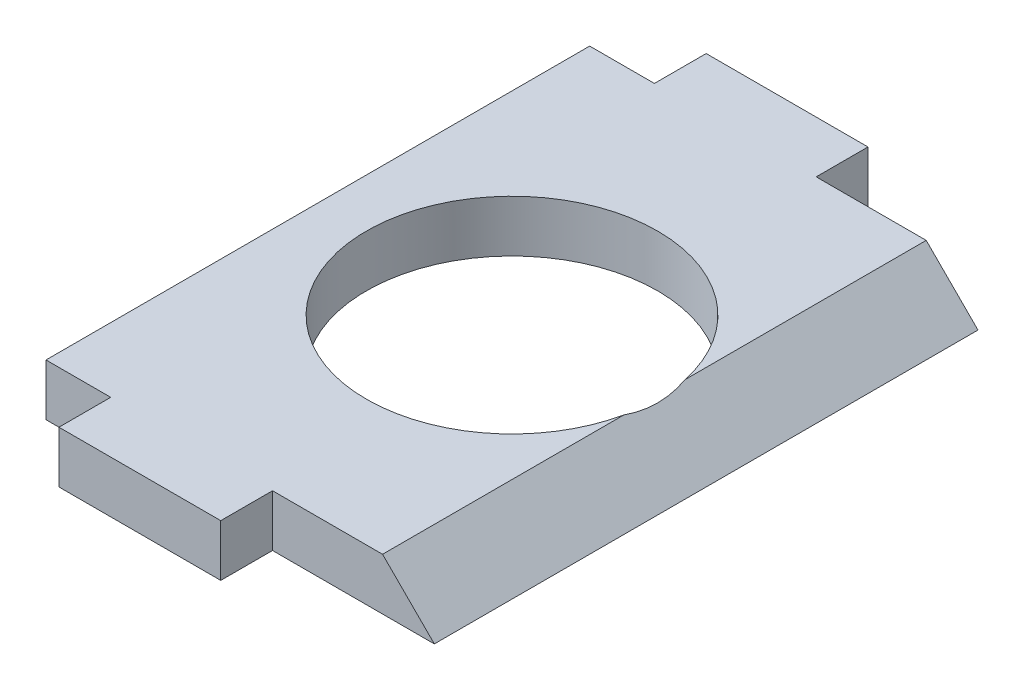
ISO-10303-21;
HEADER;
FILE_DESCRIPTION(('STEP AP214'),'2;1');
FILE_NAME('part.step','',(''),(''),'','','');
FILE_SCHEMA(('AUTOMOTIVE_DESIGN { 1 0 10303 214 1 1 1 1 }'));
ENDSEC;
DATA;
#1=APPLICATION_CONTEXT('core data for automotive mechanical design processes');
#2=APPLICATION_PROTOCOL_DEFINITION('international standard','automotive_design',2000,#1);
#3=PRODUCT_CONTEXT('',#1,'mechanical');
#4=PRODUCT('Part','Part','',(#3));
#5=PRODUCT_RELATED_PRODUCT_CATEGORY('part','',(#4));
#6=PRODUCT_DEFINITION_FORMATION('','',#4);
#7=PRODUCT_DEFINITION_CONTEXT('part definition',#1,'design');
#8=PRODUCT_DEFINITION('design','',#6,#7);
#9=PRODUCT_DEFINITION_SHAPE('','',#8);
#10=(LENGTH_UNIT() NAMED_UNIT(*) SI_UNIT(.MILLI.,.METRE.));
#11=(NAMED_UNIT(*) PLANE_ANGLE_UNIT() SI_UNIT($,.RADIAN.));
#12=(NAMED_UNIT(*) SI_UNIT($,.STERADIAN.) SOLID_ANGLE_UNIT());
#13=UNCERTAINTY_MEASURE_WITH_UNIT(LENGTH_MEASURE(1.E-05),#10,'distance_accuracy_value','');
#14=(GEOMETRIC_REPRESENTATION_CONTEXT(3) GLOBAL_UNCERTAINTY_ASSIGNED_CONTEXT((#13)) GLOBAL_UNIT_ASSIGNED_CONTEXT((#10,
#11,#12)) REPRESENTATION_CONTEXT('',''));
#15=CARTESIAN_POINT('',(0.,0.,0.));
#16=DIRECTION('',(0.,0.,1.));
#17=DIRECTION('',(1.,0.,0.));
#18=AXIS2_PLACEMENT_3D('',#15,#16,#17);
#19=CARTESIAN_POINT('',(0.,8.,-92.));
#20=DIRECTION('',(0.,0.,-1.));
#21=DIRECTION('',(-1.,0.,0.));
#22=AXIS2_PLACEMENT_3D('',#19,#20,#21);
#23=PLANE('',#22);
#24=DIRECTION('',(-0.707106781186552,0.707106781186544,0.));
#25=VECTOR('',#24,1.);
#26=CARTESIAN_POINT('',(25.9999999999997,34.,-92.));
#27=LINE('',#26,#25);
#28=CARTESIAN_POINT('',(60.,0.,-92.));
#29=VERTEX_POINT('',#28);
#30=CARTESIAN_POINT('',(51.9999999999999,8.,-92.));
#31=VERTEX_POINT('',#30);
#32=EDGE_CURVE('E169',#29,#31,#27,.T.);
#33=ORIENTED_EDGE('',*,*,#32,.F.);
#34=DIRECTION('',(1.,0.,0.));
#35=VECTOR('',#34,1.);
#36=CARTESIAN_POINT('',(0.,0.,-92.));
#37=LINE('',#36,#35);
#38=CARTESIAN_POINT('',(35.,0.,-92.));
#39=VERTEX_POINT('',#38);
#40=EDGE_CURVE('E171',#39,#29,#37,.T.);
#41=ORIENTED_EDGE('',*,*,#40,.F.);
#42=DIRECTION('',(0.,-1.,0.));
#43=VECTOR('',#42,1.);
#44=CARTESIAN_POINT('',(35.,8.,-92.));
#45=LINE('',#44,#43);
#46=CARTESIAN_POINT('',(35.,8.,-92.));
#47=VERTEX_POINT('',#46);
#48=EDGE_CURVE('E11',#47,#39,#45,.T.);
#49=ORIENTED_EDGE('',*,*,#48,.F.);
#50=DIRECTION('',(1.,0.,0.));
#51=VECTOR('',#50,1.);
#52=CARTESIAN_POINT('',(0.,8.,-92.));
#53=LINE('',#52,#51);
#54=EDGE_CURVE('E235',#47,#31,#53,.T.);
#55=ORIENTED_EDGE('',*,*,#54,.T.);
#56=EDGE_LOOP('',(#33,#41,#49,#55));
#57=FACE_BOUND('',#56,.T.);
#58=ADVANCED_FACE('F41',(#57),#23,.T.);
#59=CARTESIAN_POINT('',(35.,8.,0.));
#60=DIRECTION('',(1.,0.,0.));
#61=DIRECTION('',(0.,0.,-1.));
#62=AXIS2_PLACEMENT_3D('',#59,#60,#61);
#63=PLANE('',#62);
#64=DIRECTION('',(0.,0.,1.));
#65=VECTOR('',#64,1.);
#66=CARTESIAN_POINT('',(35.,0.,0.));
#67=LINE('',#66,#65);
#68=CARTESIAN_POINT('',(35.,0.,-100.));
#69=VERTEX_POINT('',#68);
#70=EDGE_CURVE('E174',#69,#39,#67,.T.);
#71=ORIENTED_EDGE('',*,*,#70,.F.);
#72=DIRECTION('',(0.,-1.,0.));
#73=VECTOR('',#72,1.);
#74=CARTESIAN_POINT('',(35.,8.,-100.));
#75=LINE('',#74,#73);
#76=CARTESIAN_POINT('',(35.,8.,-100.));
#77=VERTEX_POINT('',#76);
#78=EDGE_CURVE('E50',#77,#69,#75,.T.);
#79=ORIENTED_EDGE('',*,*,#78,.F.);
#80=DIRECTION('',(0.,0.,1.));
#81=VECTOR('',#80,1.);
#82=CARTESIAN_POINT('',(35.,8.,0.));
#83=LINE('',#82,#81);
#84=EDGE_CURVE('E231',#77,#47,#83,.T.);
#85=ORIENTED_EDGE('',*,*,#84,.T.);
#86=ORIENTED_EDGE('',*,*,#48,.T.);
#87=EDGE_LOOP('',(#71,#79,#85,#86));
#88=FACE_BOUND('',#87,.T.);
#89=ADVANCED_FACE('F218',(#88),#63,.T.);
#90=CARTESIAN_POINT('',(0.,8.,-100.));
#91=DIRECTION('',(0.,0.,-1.));
#92=DIRECTION('',(-1.,0.,0.));
#93=AXIS2_PLACEMENT_3D('',#90,#91,#92);
#94=PLANE('',#93);
#95=DIRECTION('',(1.,0.,0.));
#96=VECTOR('',#95,1.);
#97=CARTESIAN_POINT('',(0.,0.,-100.));
#98=LINE('',#97,#96);
#99=CARTESIAN_POINT('',(10.,0.,-100.));
#100=VERTEX_POINT('',#99);
#101=EDGE_CURVE('E177',#100,#69,#98,.T.);
#102=ORIENTED_EDGE('',*,*,#101,.F.);
#103=DIRECTION('',(0.,-1.,0.));
#104=VECTOR('',#103,1.);
#105=CARTESIAN_POINT('',(10.,8.,-100.));
#106=LINE('',#105,#104);
#107=CARTESIAN_POINT('',(10.,8.,-100.));
#108=VERTEX_POINT('',#107);
#109=EDGE_CURVE('E207',#108,#100,#106,.T.);
#110=ORIENTED_EDGE('',*,*,#109,.F.);
#111=DIRECTION('',(1.,0.,0.));
#112=VECTOR('',#111,1.);
#113=CARTESIAN_POINT('',(0.,8.,-100.));
#114=LINE('',#113,#112);
#115=EDGE_CURVE('E214',#108,#77,#114,.T.);
#116=ORIENTED_EDGE('',*,*,#115,.T.);
#117=ORIENTED_EDGE('',*,*,#78,.T.);
#118=EDGE_LOOP('',(#102,#110,#116,#117));
#119=FACE_BOUND('',#118,.T.);
#120=ADVANCED_FACE('F212',(#119),#94,.T.);
#121=CARTESIAN_POINT('',(10.,8.,0.));
#122=DIRECTION('',(-1.,0.,0.));
#123=DIRECTION('',(0.,0.,1.));
#124=AXIS2_PLACEMENT_3D('',#121,#122,#123);
#125=PLANE('',#124);
#126=DIRECTION('',(0.,0.,-1.));
#127=VECTOR('',#126,1.);
#128=CARTESIAN_POINT('',(10.,0.,0.));
#129=LINE('',#128,#127);
#130=CARTESIAN_POINT('',(10.,0.,-92.));
#131=VERTEX_POINT('',#130);
#132=EDGE_CURVE('E180',#131,#100,#129,.T.);
#133=ORIENTED_EDGE('',*,*,#132,.F.);
#134=DIRECTION('',(0.,-1.,0.));
#135=VECTOR('',#134,1.);
#136=CARTESIAN_POINT('',(10.,8.,-92.));
#137=LINE('',#136,#135);
#138=CARTESIAN_POINT('',(10.,8.,-92.));
#139=VERTEX_POINT('',#138);
#140=EDGE_CURVE('E205',#139,#131,#137,.T.);
#141=ORIENTED_EDGE('',*,*,#140,.F.);
#142=DIRECTION('',(0.,0.,-1.));
#143=VECTOR('',#142,1.);
#144=CARTESIAN_POINT('',(10.,8.,0.));
#145=LINE('',#144,#143);
#146=EDGE_CURVE('E228',#139,#108,#145,.T.);
#147=ORIENTED_EDGE('',*,*,#146,.T.);
#148=ORIENTED_EDGE('',*,*,#109,.T.);
#149=EDGE_LOOP('',(#133,#141,#147,#148));
#150=FACE_BOUND('',#149,.T.);
#151=ADVANCED_FACE('F225',(#150),#125,.T.);
#152=CARTESIAN_POINT('',(0.,8.,-92.));
#153=DIRECTION('',(0.,0.,-1.));
#154=DIRECTION('',(-1.,0.,0.));
#155=AXIS2_PLACEMENT_3D('',#152,#153,#154);
#156=PLANE('',#155);
#157=DIRECTION('',(1.,0.,0.));
#158=VECTOR('',#157,1.);
#159=CARTESIAN_POINT('',(0.,0.,-92.));
#160=LINE('',#159,#158);
#161=CARTESIAN_POINT('',(0.,0.,-92.));
#162=VERTEX_POINT('',#161);
#163=EDGE_CURVE('E183',#162,#131,#160,.T.);
#164=ORIENTED_EDGE('',*,*,#163,.F.);
#165=DIRECTION('',(0.,-1.,0.));
#166=VECTOR('',#165,1.);
#167=CARTESIAN_POINT('',(0.,8.,-92.));
#168=LINE('',#167,#166);
#169=CARTESIAN_POINT('',(0.,8.,-92.));
#170=VERTEX_POINT('',#169);
#171=EDGE_CURVE('E203',#170,#162,#168,.T.);
#172=ORIENTED_EDGE('',*,*,#171,.F.);
#173=DIRECTION('',(1.,0.,0.));
#174=VECTOR('',#173,1.);
#175=CARTESIAN_POINT('',(0.,8.,-92.));
#176=LINE('',#175,#174);
#177=EDGE_CURVE('E233',#170,#139,#176,.T.);
#178=ORIENTED_EDGE('',*,*,#177,.T.);
#179=ORIENTED_EDGE('',*,*,#140,.T.);
#180=EDGE_LOOP('',(#164,#172,#178,#179));
#181=FACE_BOUND('',#180,.T.);
#182=ADVANCED_FACE('F246',(#181),#156,.T.);
#183=CARTESIAN_POINT('',(0.,8.,0.));
#184=DIRECTION('',(-1.,0.,0.));
#185=DIRECTION('',(0.,0.,1.));
#186=AXIS2_PLACEMENT_3D('',#183,#184,#185);
#187=PLANE('',#186);
#188=DIRECTION('',(0.,0.,-1.));
#189=VECTOR('',#188,1.);
#190=CARTESIAN_POINT('',(0.,0.,0.));
#191=LINE('',#190,#189);
#192=CARTESIAN_POINT('',(0.,0.,-8.00000000000001));
#193=VERTEX_POINT('',#192);
#194=EDGE_CURVE('E186',#193,#162,#191,.T.);
#195=ORIENTED_EDGE('',*,*,#194,.F.);
#196=DIRECTION('',(0.,-1.,0.));
#197=VECTOR('',#196,1.);
#198=CARTESIAN_POINT('',(0.,8.,-8.00000000000001));
#199=LINE('',#198,#197);
#200=CARTESIAN_POINT('',(0.,8.,-8.00000000000001));
#201=VERTEX_POINT('',#200);
#202=EDGE_CURVE('E201',#201,#193,#199,.T.);
#203=ORIENTED_EDGE('',*,*,#202,.F.);
#204=DIRECTION('',(0.,0.,-1.));
#205=VECTOR('',#204,1.);
#206=CARTESIAN_POINT('',(0.,8.,0.));
#207=LINE('',#206,#205);
#208=EDGE_CURVE('E240',#201,#170,#207,.T.);
#209=ORIENTED_EDGE('',*,*,#208,.T.);
#210=ORIENTED_EDGE('',*,*,#171,.T.);
#211=EDGE_LOOP('',(#195,#203,#209,#210));
#212=FACE_BOUND('',#211,.T.);
#213=ADVANCED_FACE('F244',(#212),#187,.T.);
#214=CARTESIAN_POINT('',(0.,8.,-8.00000000000001));
#215=DIRECTION('',(0.,0.,-1.));
#216=DIRECTION('',(-1.,0.,0.));
#217=AXIS2_PLACEMENT_3D('',#214,#215,#216);
#218=PLANE('',#217);
#219=DIRECTION('',(1.,0.,0.));
#220=VECTOR('',#219,1.);
#221=CARTESIAN_POINT('',(0.,0.,-8.00000000000001));
#222=LINE('',#221,#220);
#223=CARTESIAN_POINT('',(10.,0.,-8.00000000000001));
#224=VERTEX_POINT('',#223);
#225=EDGE_CURVE('E189',#193,#224,#222,.T.);
#226=ORIENTED_EDGE('',*,*,#225,.T.);
#227=DIRECTION('',(0.,-1.,0.));
#228=VECTOR('',#227,1.);
#229=CARTESIAN_POINT('',(10.,8.,-8.00000000000001));
#230=LINE('',#229,#228);
#231=CARTESIAN_POINT('',(10.,8.,-8.00000000000001));
#232=VERTEX_POINT('',#231);
#233=EDGE_CURVE('E154',#232,#224,#230,.T.);
#234=ORIENTED_EDGE('',*,*,#233,.F.);
#235=DIRECTION('',(1.,0.,0.));
#236=VECTOR('',#235,1.);
#237=CARTESIAN_POINT('',(0.,8.,-8.00000000000001));
#238=LINE('',#237,#236);
#239=EDGE_CURVE('E142',#201,#232,#238,.T.);
#240=ORIENTED_EDGE('',*,*,#239,.F.);
#241=ORIENTED_EDGE('',*,*,#202,.T.);
#242=EDGE_LOOP('',(#226,#234,#240,#241));
#243=FACE_BOUND('',#242,.T.);
#244=ADVANCED_FACE('F249',(#243),#218,.F.);
#245=CARTESIAN_POINT('',(10.,8.,0.));
#246=DIRECTION('',(1.,0.,0.));
#247=DIRECTION('',(0.,0.,-1.));
#248=AXIS2_PLACEMENT_3D('',#245,#246,#247);
#249=PLANE('',#248);
#250=DIRECTION('',(0.,0.,1.));
#251=VECTOR('',#250,1.);
#252=CARTESIAN_POINT('',(10.,0.,0.));
#253=LINE('',#252,#251);
#254=CARTESIAN_POINT('',(10.,0.,0.));
#255=VERTEX_POINT('',#254);
#256=EDGE_CURVE('E151',#224,#255,#253,.T.);
#257=ORIENTED_EDGE('',*,*,#256,.T.);
#258=DIRECTION('',(0.,-1.,0.));
#259=VECTOR('',#258,1.);
#260=CARTESIAN_POINT('',(10.,8.,0.));
#261=LINE('',#260,#259);
#262=CARTESIAN_POINT('',(10.,8.,0.));
#263=VERTEX_POINT('',#262);
#264=EDGE_CURVE('E148',#263,#255,#261,.T.);
#265=ORIENTED_EDGE('',*,*,#264,.F.);
#266=DIRECTION('',(0.,0.,1.));
#267=VECTOR('',#266,1.);
#268=CARTESIAN_POINT('',(10.,8.,0.));
#269=LINE('',#268,#267);
#270=EDGE_CURVE('E133',#232,#263,#269,.T.);
#271=ORIENTED_EDGE('',*,*,#270,.F.);
#272=ORIENTED_EDGE('',*,*,#233,.T.);
#273=EDGE_LOOP('',(#257,#265,#271,#272));
#274=FACE_BOUND('',#273,.T.);
#275=ADVANCED_FACE('F149',(#274),#249,.F.);
#276=CARTESIAN_POINT('',(0.,8.,0.));
#277=DIRECTION('',(0.,0.,-1.));
#278=DIRECTION('',(-1.,0.,0.));
#279=AXIS2_PLACEMENT_3D('',#276,#277,#278);
#280=PLANE('',#279);
#281=DIRECTION('',(1.,0.,0.));
#282=VECTOR('',#281,1.);
#283=CARTESIAN_POINT('',(0.,0.,0.));
#284=LINE('',#283,#282);
#285=CARTESIAN_POINT('',(35.,0.,0.));
#286=VERTEX_POINT('',#285);
#287=EDGE_CURVE('E192',#255,#286,#284,.T.);
#288=ORIENTED_EDGE('',*,*,#287,.T.);
#289=DIRECTION('',(0.,-1.,0.));
#290=VECTOR('',#289,1.);
#291=CARTESIAN_POINT('',(35.,8.,0.));
#292=LINE('',#291,#290);
#293=CARTESIAN_POINT('',(35.,8.,0.));
#294=VERTEX_POINT('',#293);
#295=EDGE_CURVE('E155',#294,#286,#292,.T.);
#296=ORIENTED_EDGE('',*,*,#295,.F.);
#297=DIRECTION('',(1.,0.,0.));
#298=VECTOR('',#297,1.);
#299=CARTESIAN_POINT('',(0.,8.,0.));
#300=LINE('',#299,#298);
#301=EDGE_CURVE('E138',#263,#294,#300,.T.);
#302=ORIENTED_EDGE('',*,*,#301,.F.);
#303=ORIENTED_EDGE('',*,*,#264,.T.);
#304=EDGE_LOOP('',(#288,#296,#302,#303));
#305=FACE_BOUND('',#304,.T.);
#306=ADVANCED_FACE('F157',(#305),#280,.F.);
#307=CARTESIAN_POINT('',(35.,8.,0.));
#308=DIRECTION('',(-1.,0.,0.));
#309=DIRECTION('',(0.,0.,1.));
#310=AXIS2_PLACEMENT_3D('',#307,#308,#309);
#311=PLANE('',#310);
#312=DIRECTION('',(0.,0.,-1.));
#313=VECTOR('',#312,1.);
#314=CARTESIAN_POINT('',(35.,0.,0.));
#315=LINE('',#314,#313);
#316=CARTESIAN_POINT('',(35.,0.,-8.));
#317=VERTEX_POINT('',#316);
#318=EDGE_CURVE('E95',#286,#317,#315,.T.);
#319=ORIENTED_EDGE('',*,*,#318,.T.);
#320=DIRECTION('',(0.,-1.,0.));
#321=VECTOR('',#320,1.);
#322=CARTESIAN_POINT('',(35.,8.,-8.));
#323=LINE('',#322,#321);
#324=CARTESIAN_POINT('',(35.,8.,-8.));
#325=VERTEX_POINT('',#324);
#326=EDGE_CURVE('E164',#325,#317,#323,.T.);
#327=ORIENTED_EDGE('',*,*,#326,.F.);
#328=DIRECTION('',(0.,0.,-1.));
#329=VECTOR('',#328,1.);
#330=CARTESIAN_POINT('',(35.,8.,0.));
#331=LINE('',#330,#329);
#332=EDGE_CURVE('E58',#294,#325,#331,.T.);
#333=ORIENTED_EDGE('',*,*,#332,.F.);
#334=ORIENTED_EDGE('',*,*,#295,.T.);
#335=EDGE_LOOP('',(#319,#327,#333,#334));
#336=FACE_BOUND('',#335,.T.);
#337=ADVANCED_FACE('F301',(#336),#311,.F.);
#338=CARTESIAN_POINT('',(30.,8.,-50.));
#339=DIRECTION('',(0.,-1.,0.));
#340=DIRECTION('',(0.,0.,-1.));
#341=AXIS2_PLACEMENT_3D('',#338,#339,#340);
#342=CYLINDRICAL_SURFACE('',#341,22.5);
#343=CARTESIAN_POINT('',(30.,29.9999999999997,-50.));
#344=DIRECTION('',(-0.707106781186544,-0.707106781186552,0.));
#345=DIRECTION('',(0.707106781186552,-0.707106781186544,0.));
#346=AXIS2_PLACEMENT_3D('',#343,#344,#345);
#347=ELLIPSE('',#346,31.8198051533945,22.5);
#348=CARTESIAN_POINT('',(51.9999999999999,8.,-54.7169905660288));
#349=VERTEX_POINT('',#348);
#350=CARTESIAN_POINT('',(51.9999999999999,8.,-45.2830094339712));
#351=VERTEX_POINT('',#350);
#352=EDGE_CURVE('E369',#349,#351,#347,.T.);
#353=ORIENTED_EDGE('',*,*,#352,.F.);
#354=CARTESIAN_POINT('',(30.,8.,-50.));
#355=DIRECTION('',(0.,1.,0.));
#356=DIRECTION('',(0.,0.,1.));
#357=AXIS2_PLACEMENT_3D('',#354,#355,#356);
#358=CIRCLE('',#357,22.5);
#359=EDGE_CURVE('E197',#349,#351,#358,.T.);
#360=ORIENTED_EDGE('',*,*,#359,.T.);
#361=EDGE_LOOP('',(#353,#360));
#362=FACE_BOUND('',#361,.T.);
#363=CARTESIAN_POINT('',(30.,0.,-50.));
#364=DIRECTION('',(0.,1.,0.));
#365=DIRECTION('',(0.,0.,1.));
#366=AXIS2_PLACEMENT_3D('',#363,#364,#365);
#367=CIRCLE('',#366,22.5);
#368=CARTESIAN_POINT('',(30.,0.,-27.5));
#369=VERTEX_POINT('',#368);
#370=EDGE_CURVE('E165',#369,#369,#367,.T.);
#371=ORIENTED_EDGE('',*,*,#370,.F.);
#372=EDGE_LOOP('',(#371));
#373=FACE_BOUND('',#372,.T.);
#374=ADVANCED_FACE('F43',(#362,#373),#342,.F.);
#375=CARTESIAN_POINT('',(0.,8.,-8.));
#376=DIRECTION('',(0.,0.,-1.));
#377=DIRECTION('',(-1.,0.,0.));
#378=AXIS2_PLACEMENT_3D('',#375,#376,#377);
#379=PLANE('',#378);
#380=DIRECTION('',(1.,0.,0.));
#381=VECTOR('',#380,1.);
#382=CARTESIAN_POINT('',(0.,0.,-8.));
#383=LINE('',#382,#381);
#384=CARTESIAN_POINT('',(60.,0.,-8.));
#385=VERTEX_POINT('',#384);
#386=EDGE_CURVE('E195',#317,#385,#383,.T.);
#387=ORIENTED_EDGE('',*,*,#386,.T.);
#388=DIRECTION('',(0.707106781186552,-0.707106781186544,0.));
#389=VECTOR('',#388,1.);
#390=CARTESIAN_POINT('',(60.,0.,-8.));
#391=LINE('',#390,#389);
#392=CARTESIAN_POINT('',(51.9999999999999,8.,-8.));
#393=VERTEX_POINT('',#392);
#394=EDGE_CURVE('E103',#393,#385,#391,.T.);
#395=ORIENTED_EDGE('',*,*,#394,.F.);
#396=DIRECTION('',(1.,0.,0.));
#397=VECTOR('',#396,1.);
#398=CARTESIAN_POINT('',(0.,8.,-8.));
#399=LINE('',#398,#397);
#400=EDGE_CURVE('E159',#325,#393,#399,.T.);
#401=ORIENTED_EDGE('',*,*,#400,.F.);
#402=ORIENTED_EDGE('',*,*,#326,.T.);
#403=EDGE_LOOP('',(#387,#395,#401,#402));
#404=FACE_BOUND('',#403,.T.);
#405=ADVANCED_FACE('F316',(#404),#379,.F.);
#406=CARTESIAN_POINT('',(0.,8.,0.));
#407=DIRECTION('',(0.,1.,0.));
#408=DIRECTION('',(0.,0.,1.));
#409=AXIS2_PLACEMENT_3D('',#406,#407,#408);
#410=PLANE('',#409);
#411=DIRECTION('',(0.,0.,1.));
#412=VECTOR('',#411,1.);
#413=CARTESIAN_POINT('',(51.9999999999999,8.,-100.));
#414=LINE('',#413,#412);
#415=EDGE_CURVE('E365',#31,#349,#414,.T.);
#416=ORIENTED_EDGE('',*,*,#415,.F.);
#417=ORIENTED_EDGE('',*,*,#54,.F.);
#418=ORIENTED_EDGE('',*,*,#84,.F.);
#419=ORIENTED_EDGE('',*,*,#115,.F.);
#420=ORIENTED_EDGE('',*,*,#146,.F.);
#421=ORIENTED_EDGE('',*,*,#177,.F.);
#422=ORIENTED_EDGE('',*,*,#208,.F.);
#423=ORIENTED_EDGE('',*,*,#239,.T.);
#424=ORIENTED_EDGE('',*,*,#270,.T.);
#425=ORIENTED_EDGE('',*,*,#301,.T.);
#426=ORIENTED_EDGE('',*,*,#332,.T.);
#427=ORIENTED_EDGE('',*,*,#400,.T.);
#428=EDGE_CURVE('E374',#351,#393,#414,.T.);
#429=ORIENTED_EDGE('',*,*,#428,.F.);
#430=ORIENTED_EDGE('',*,*,#359,.F.);
#431=EDGE_LOOP('',(#416,#417,#418,#419,#420,#421,#422,#423,#424,#425,#426,#427,#429,#430));
#432=FACE_BOUND('',#431,.T.);
#433=ADVANCED_FACE('F136',(#432),#410,.T.);
#434=CARTESIAN_POINT('',(0.,0.,0.));
#435=DIRECTION('',(0.,1.,0.));
#436=DIRECTION('',(0.,0.,1.));
#437=AXIS2_PLACEMENT_3D('',#434,#435,#436);
#438=PLANE('',#437);
#439=ORIENTED_EDGE('',*,*,#370,.T.);
#440=EDGE_LOOP('',(#439));
#441=FACE_BOUND('',#440,.T.);
#442=DIRECTION('',(0.,0.,-1.));
#443=VECTOR('',#442,1.);
#444=CARTESIAN_POINT('',(60.,0.,0.));
#445=LINE('',#444,#443);
#446=EDGE_CURVE('E168',#385,#29,#445,.T.);
#447=ORIENTED_EDGE('',*,*,#446,.F.);
#448=ORIENTED_EDGE('',*,*,#386,.F.);
#449=ORIENTED_EDGE('',*,*,#318,.F.);
#450=ORIENTED_EDGE('',*,*,#287,.F.);
#451=ORIENTED_EDGE('',*,*,#256,.F.);
#452=ORIENTED_EDGE('',*,*,#225,.F.);
#453=ORIENTED_EDGE('',*,*,#194,.T.);
#454=ORIENTED_EDGE('',*,*,#163,.T.);
#455=ORIENTED_EDGE('',*,*,#132,.T.);
#456=ORIENTED_EDGE('',*,*,#101,.T.);
#457=ORIENTED_EDGE('',*,*,#70,.T.);
#458=ORIENTED_EDGE('',*,*,#40,.T.);
#459=EDGE_LOOP('',(#447,#448,#449,#450,#451,#452,#453,#454,#455,#456,#457,#458));
#460=FACE_BOUND('',#459,.T.);
#461=ADVANCED_FACE('F221',(#441,#460),#438,.F.);
#462=CARTESIAN_POINT('',(60.,0.,-100.));
#463=DIRECTION('',(-0.707106781186544,-0.707106781186552,0.));
#464=DIRECTION('',(0.707106781186552,-0.707106781186544,0.));
#465=AXIS2_PLACEMENT_3D('',#462,#463,#464);
#466=PLANE('',#465);
#467=ORIENTED_EDGE('',*,*,#32,.T.);
#468=ORIENTED_EDGE('',*,*,#415,.T.);
#469=ORIENTED_EDGE('',*,*,#352,.T.);
#470=ORIENTED_EDGE('',*,*,#428,.T.);
#471=ORIENTED_EDGE('',*,*,#394,.T.);
#472=ORIENTED_EDGE('',*,*,#446,.T.);
#473=EDGE_LOOP('',(#467,#468,#469,#470,#471,#472));
#474=FACE_BOUND('',#473,.T.);
#475=ADVANCED_FACE('F345',(#474),#466,.F.);
#476=CLOSED_SHELL('',(#58,#89,#120,#151,#182,#213,#244,#275,#306,#337,#374,#405,#433,#461,#475));
#477=MANIFOLD_SOLID_BREP('B2',#476);
#478=ADVANCED_BREP_SHAPE_REPRESENTATION('',(#18,#477),#14);
#479=SHAPE_DEFINITION_REPRESENTATION(#9,#478);
ENDSEC;
END-ISO-10303-21;
